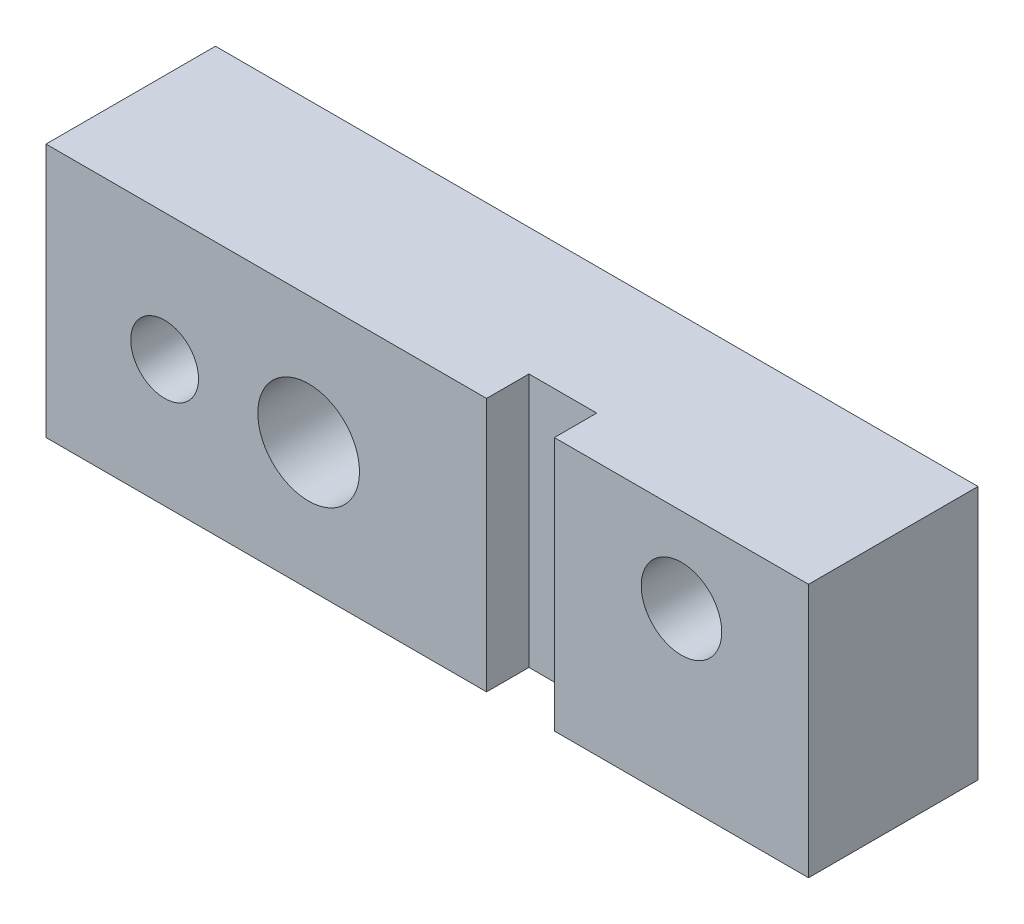
ISO-10303-21;
HEADER;
FILE_DESCRIPTION(('STEP AP214'),'2;1');
FILE_NAME('part.step','',(''),(''),'','','');
FILE_SCHEMA(('AUTOMOTIVE_DESIGN { 1 0 10303 214 1 1 1 1 }'));
ENDSEC;
DATA;
#1=APPLICATION_CONTEXT('core data for automotive mechanical design processes');
#2=APPLICATION_PROTOCOL_DEFINITION('international standard','automotive_design',2000,#1);
#3=PRODUCT_CONTEXT('',#1,'mechanical');
#4=PRODUCT('Part','Part','',(#3));
#5=PRODUCT_RELATED_PRODUCT_CATEGORY('part','',(#4));
#6=PRODUCT_DEFINITION_FORMATION('','',#4);
#7=PRODUCT_DEFINITION_CONTEXT('part definition',#1,'design');
#8=PRODUCT_DEFINITION('design','',#6,#7);
#9=PRODUCT_DEFINITION_SHAPE('','',#8);
#10=(LENGTH_UNIT() NAMED_UNIT(*) SI_UNIT(.MILLI.,.METRE.));
#11=(NAMED_UNIT(*) PLANE_ANGLE_UNIT() SI_UNIT($,.RADIAN.));
#12=(NAMED_UNIT(*) SI_UNIT($,.STERADIAN.) SOLID_ANGLE_UNIT());
#13=UNCERTAINTY_MEASURE_WITH_UNIT(LENGTH_MEASURE(1.E-05),#10,'distance_accuracy_value','');
#14=(GEOMETRIC_REPRESENTATION_CONTEXT(3) GLOBAL_UNCERTAINTY_ASSIGNED_CONTEXT((#13)) GLOBAL_UNIT_ASSIGNED_CONTEXT((#10,
#11,#12)) REPRESENTATION_CONTEXT('',''));
#15=CARTESIAN_POINT('',(0.,0.,0.));
#16=DIRECTION('',(0.,0.,1.));
#17=DIRECTION('',(1.,0.,0.));
#18=AXIS2_PLACEMENT_3D('',#15,#16,#17);
#19=CARTESIAN_POINT('',(0.,0.,0.));
#20=DIRECTION('',(0.,0.,-1.));
#21=DIRECTION('',(-1.,0.,0.));
#22=AXIS2_PLACEMENT_3D('',#19,#20,#21);
#23=PLANE('',#22);
#24=CARTESIAN_POINT('',(14.,15.,0.));
#25=DIRECTION('',(0.,0.,1.));
#26=DIRECTION('',(1.,0.,0.));
#27=AXIS2_PLACEMENT_3D('',#24,#25,#26);
#28=CIRCLE('',#27,4.);
#29=CARTESIAN_POINT('',(18.,15.,0.));
#30=VERTEX_POINT('',#29);
#31=EDGE_CURVE('E121',#30,#30,#28,.T.);
#32=ORIENTED_EDGE('',*,*,#31,.F.);
#33=EDGE_LOOP('',(#32));
#34=FACE_BOUND('',#33,.T.);
#35=CARTESIAN_POINT('',(31.,15.,0.));
#36=DIRECTION('',(0.,0.,1.));
#37=DIRECTION('',(1.,0.,0.));
#38=AXIS2_PLACEMENT_3D('',#35,#36,#37);
#39=CIRCLE('',#38,5.99999999999999);
#40=CARTESIAN_POINT('',(37.,15.,0.));
#41=VERTEX_POINT('',#40);
#42=EDGE_CURVE('E135',#41,#41,#39,.T.);
#43=ORIENTED_EDGE('',*,*,#42,.F.);
#44=EDGE_LOOP('',(#43));
#45=FACE_BOUND('',#44,.T.);
#46=DIRECTION('',(1.,0.,0.));
#47=VECTOR('',#46,1.);
#48=CARTESIAN_POINT('',(0.,0.,0.));
#49=LINE('',#48,#47);
#50=CARTESIAN_POINT('',(0.,0.,0.));
#51=VERTEX_POINT('',#50);
#52=CARTESIAN_POINT('',(52.,0.,0.));
#53=VERTEX_POINT('',#52);
#54=EDGE_CURVE('E183',#51,#53,#49,.T.);
#55=ORIENTED_EDGE('',*,*,#54,.T.);
#56=DIRECTION('',(0.,-1.,0.));
#57=VECTOR('',#56,1.);
#58=CARTESIAN_POINT('',(52.,30.,0.));
#59=LINE('',#58,#57);
#60=CARTESIAN_POINT('',(52.,30.,0.));
#61=VERTEX_POINT('',#60);
#62=EDGE_CURVE('E142',#61,#53,#59,.T.);
#63=ORIENTED_EDGE('',*,*,#62,.F.);
#64=DIRECTION('',(-1.,0.,0.));
#65=VECTOR('',#64,1.);
#66=CARTESIAN_POINT('',(0.,30.,0.));
#67=LINE('',#66,#65);
#68=CARTESIAN_POINT('',(0.,30.,0.));
#69=VERTEX_POINT('',#68);
#70=EDGE_CURVE('E82',#61,#69,#67,.T.);
#71=ORIENTED_EDGE('',*,*,#70,.T.);
#72=DIRECTION('',(0.,-1.,0.));
#73=VECTOR('',#72,1.);
#74=CARTESIAN_POINT('',(0.,0.,0.));
#75=LINE('',#74,#73);
#76=EDGE_CURVE('E163',#69,#51,#75,.T.);
#77=ORIENTED_EDGE('',*,*,#76,.T.);
#78=EDGE_LOOP('',(#55,#63,#71,#77));
#79=FACE_BOUND('',#78,.T.);
#80=ADVANCED_FACE('F35',(#34,#45,#79),#23,.F.);
#81=CARTESIAN_POINT('',(0.,0.,-20.));
#82=DIRECTION('',(-1.,0.,0.));
#83=DIRECTION('',(0.,0.,1.));
#84=AXIS2_PLACEMENT_3D('',#81,#82,#83);
#85=PLANE('',#84);
#86=ORIENTED_EDGE('',*,*,#76,.F.);
#87=DIRECTION('',(0.,0.,1.));
#88=VECTOR('',#87,1.);
#89=CARTESIAN_POINT('',(0.,30.,-20.));
#90=LINE('',#89,#88);
#91=CARTESIAN_POINT('',(0.,30.,-20.));
#92=VERTEX_POINT('',#91);
#93=EDGE_CURVE('E11',#92,#69,#90,.T.);
#94=ORIENTED_EDGE('',*,*,#93,.F.);
#95=DIRECTION('',(0.,-1.,0.));
#96=VECTOR('',#95,1.);
#97=CARTESIAN_POINT('',(0.,0.,-20.));
#98=LINE('',#97,#96);
#99=CARTESIAN_POINT('',(0.,0.,-20.));
#100=VERTEX_POINT('',#99);
#101=EDGE_CURVE('E170',#92,#100,#98,.T.);
#102=ORIENTED_EDGE('',*,*,#101,.T.);
#103=DIRECTION('',(0.,0.,1.));
#104=VECTOR('',#103,1.);
#105=CARTESIAN_POINT('',(0.,0.,-20.));
#106=LINE('',#105,#104);
#107=EDGE_CURVE('E39',#100,#51,#106,.T.);
#108=ORIENTED_EDGE('',*,*,#107,.T.);
#109=EDGE_LOOP('',(#86,#94,#102,#108));
#110=FACE_BOUND('',#109,.T.);
#111=ADVANCED_FACE('F37',(#110),#85,.T.);
#112=CARTESIAN_POINT('',(0.,30.,-20.));
#113=DIRECTION('',(0.,1.,0.));
#114=DIRECTION('',(0.,0.,1.));
#115=AXIS2_PLACEMENT_3D('',#112,#113,#114);
#116=PLANE('',#115);
#117=DIRECTION('',(0.,0.,1.));
#118=VECTOR('',#117,1.);
#119=CARTESIAN_POINT('',(52.,30.,-5.));
#120=LINE('',#119,#118);
#121=CARTESIAN_POINT('',(52.,30.,-5.));
#122=VERTEX_POINT('',#121);
#123=EDGE_CURVE('E161',#122,#61,#120,.T.);
#124=ORIENTED_EDGE('',*,*,#123,.F.);
#125=DIRECTION('',(-1.,0.,0.));
#126=VECTOR('',#125,1.);
#127=CARTESIAN_POINT('',(52.,30.,-5.));
#128=LINE('',#127,#126);
#129=CARTESIAN_POINT('',(60.,30.,-5.));
#130=VERTEX_POINT('',#129);
#131=EDGE_CURVE('E155',#130,#122,#128,.T.);
#132=ORIENTED_EDGE('',*,*,#131,.F.);
#133=DIRECTION('',(0.,0.,1.));
#134=VECTOR('',#133,1.);
#135=CARTESIAN_POINT('',(60.,30.,-5.));
#136=LINE('',#135,#134);
#137=CARTESIAN_POINT('',(60.,30.,0.));
#138=VERTEX_POINT('',#137);
#139=EDGE_CURVE('E164',#130,#138,#136,.T.);
#140=ORIENTED_EDGE('',*,*,#139,.T.);
#141=CARTESIAN_POINT('',(90.,30.,0.));
#142=VERTEX_POINT('',#141);
#143=EDGE_CURVE('E173',#142,#138,#67,.T.);
#144=ORIENTED_EDGE('',*,*,#143,.F.);
#145=DIRECTION('',(0.,0.,1.));
#146=VECTOR('',#145,1.);
#147=CARTESIAN_POINT('',(90.,30.,-20.));
#148=LINE('',#147,#146);
#149=CARTESIAN_POINT('',(90.,30.,-20.));
#150=VERTEX_POINT('',#149);
#151=EDGE_CURVE('E44',#150,#142,#148,.T.);
#152=ORIENTED_EDGE('',*,*,#151,.F.);
#153=DIRECTION('',(-1.,0.,0.));
#154=VECTOR('',#153,1.);
#155=CARTESIAN_POINT('',(0.,30.,-20.));
#156=LINE('',#155,#154);
#157=EDGE_CURVE('E178',#150,#92,#156,.T.);
#158=ORIENTED_EDGE('',*,*,#157,.T.);
#159=ORIENTED_EDGE('',*,*,#93,.T.);
#160=ORIENTED_EDGE('',*,*,#70,.F.);
#161=EDGE_LOOP('',(#124,#132,#140,#144,#152,#158,#159,#160));
#162=FACE_BOUND('',#161,.T.);
#163=ADVANCED_FACE('F204',(#162),#116,.T.);
#164=CARTESIAN_POINT('',(90.,0.,-20.));
#165=DIRECTION('',(1.,0.,0.));
#166=DIRECTION('',(0.,0.,-1.));
#167=AXIS2_PLACEMENT_3D('',#164,#165,#166);
#168=PLANE('',#167);
#169=DIRECTION('',(0.,1.,0.));
#170=VECTOR('',#169,1.);
#171=CARTESIAN_POINT('',(90.,0.,0.));
#172=LINE('',#171,#170);
#173=CARTESIAN_POINT('',(90.,0.,0.));
#174=VERTEX_POINT('',#173);
#175=EDGE_CURVE('E186',#174,#142,#172,.T.);
#176=ORIENTED_EDGE('',*,*,#175,.F.);
#177=DIRECTION('',(0.,0.,1.));
#178=VECTOR('',#177,1.);
#179=CARTESIAN_POINT('',(90.,0.,-20.));
#180=LINE('',#179,#178);
#181=CARTESIAN_POINT('',(90.,0.,-20.));
#182=VERTEX_POINT('',#181);
#183=EDGE_CURVE('E191',#182,#174,#180,.T.);
#184=ORIENTED_EDGE('',*,*,#183,.F.);
#185=DIRECTION('',(0.,1.,0.));
#186=VECTOR('',#185,1.);
#187=CARTESIAN_POINT('',(90.,0.,-20.));
#188=LINE('',#187,#186);
#189=EDGE_CURVE('E175',#182,#150,#188,.T.);
#190=ORIENTED_EDGE('',*,*,#189,.T.);
#191=ORIENTED_EDGE('',*,*,#151,.T.);
#192=EDGE_LOOP('',(#176,#184,#190,#191));
#193=FACE_BOUND('',#192,.T.);
#194=ADVANCED_FACE('F233',(#193),#168,.T.);
#195=CARTESIAN_POINT('',(0.,0.,-20.));
#196=DIRECTION('',(0.,-1.,0.));
#197=DIRECTION('',(0.,0.,-1.));
#198=AXIS2_PLACEMENT_3D('',#195,#196,#197);
#199=PLANE('',#198);
#200=DIRECTION('',(0.,0.,1.));
#201=VECTOR('',#200,1.);
#202=CARTESIAN_POINT('',(52.,0.,-5.));
#203=LINE('',#202,#201);
#204=CARTESIAN_POINT('',(52.,0.,-5.));
#205=VERTEX_POINT('',#204);
#206=EDGE_CURVE('E158',#205,#53,#203,.T.);
#207=ORIENTED_EDGE('',*,*,#206,.T.);
#208=ORIENTED_EDGE('',*,*,#54,.F.);
#209=ORIENTED_EDGE('',*,*,#107,.F.);
#210=DIRECTION('',(1.,0.,0.));
#211=VECTOR('',#210,1.);
#212=CARTESIAN_POINT('',(0.,0.,-20.));
#213=LINE('',#212,#211);
#214=EDGE_CURVE('E172',#100,#182,#213,.T.);
#215=ORIENTED_EDGE('',*,*,#214,.T.);
#216=ORIENTED_EDGE('',*,*,#183,.T.);
#217=CARTESIAN_POINT('',(60.,0.,0.));
#218=VERTEX_POINT('',#217);
#219=EDGE_CURVE('E182',#218,#174,#49,.T.);
#220=ORIENTED_EDGE('',*,*,#219,.F.);
#221=DIRECTION('',(0.,0.,1.));
#222=VECTOR('',#221,1.);
#223=CARTESIAN_POINT('',(60.,0.,-5.));
#224=LINE('',#223,#222);
#225=CARTESIAN_POINT('',(60.,0.,-5.));
#226=VERTEX_POINT('',#225);
#227=EDGE_CURVE('E52',#226,#218,#224,.T.);
#228=ORIENTED_EDGE('',*,*,#227,.F.);
#229=DIRECTION('',(1.,0.,0.));
#230=VECTOR('',#229,1.);
#231=CARTESIAN_POINT('',(52.,0.,-5.));
#232=LINE('',#231,#230);
#233=EDGE_CURVE('E148',#205,#226,#232,.T.);
#234=ORIENTED_EDGE('',*,*,#233,.F.);
#235=EDGE_LOOP('',(#207,#208,#209,#215,#216,#220,#228,#234));
#236=FACE_BOUND('',#235,.T.);
#237=ADVANCED_FACE('F195',(#236),#199,.T.);
#238=CARTESIAN_POINT('',(0.,0.,-20.));
#239=DIRECTION('',(0.,0.,-1.));
#240=DIRECTION('',(-1.,0.,0.));
#241=AXIS2_PLACEMENT_3D('',#238,#239,#240);
#242=PLANE('',#241);
#243=CARTESIAN_POINT('',(31.,15.,-20.));
#244=DIRECTION('',(0.,0.,1.));
#245=DIRECTION('',(1.,0.,0.));
#246=AXIS2_PLACEMENT_3D('',#243,#244,#245);
#247=CIRCLE('',#246,3.);
#248=CARTESIAN_POINT('',(34.,15.,-20.));
#249=VERTEX_POINT('',#248);
#250=EDGE_CURVE('E124',#249,#249,#247,.T.);
#251=ORIENTED_EDGE('',*,*,#250,.T.);
#252=EDGE_LOOP('',(#251));
#253=FACE_BOUND('',#252,.T.);
#254=CARTESIAN_POINT('',(75.,20.,-20.));
#255=DIRECTION('',(0.,0.,1.));
#256=DIRECTION('',(1.,0.,0.));
#257=AXIS2_PLACEMENT_3D('',#254,#255,#256);
#258=CIRCLE('',#257,4.75);
#259=CARTESIAN_POINT('',(79.75,20.,-20.));
#260=VERTEX_POINT('',#259);
#261=EDGE_CURVE('E139',#260,#260,#258,.T.);
#262=ORIENTED_EDGE('',*,*,#261,.T.);
#263=EDGE_LOOP('',(#262));
#264=FACE_BOUND('',#263,.T.);
#265=ORIENTED_EDGE('',*,*,#101,.F.);
#266=ORIENTED_EDGE('',*,*,#157,.F.);
#267=ORIENTED_EDGE('',*,*,#189,.F.);
#268=ORIENTED_EDGE('',*,*,#214,.F.);
#269=EDGE_LOOP('',(#265,#266,#267,#268));
#270=FACE_BOUND('',#269,.T.);
#271=ADVANCED_FACE('F211',(#253,#264,#270),#242,.T.);
#272=CARTESIAN_POINT('',(75.,20.,0.));
#273=DIRECTION('',(0.,0.,1.));
#274=DIRECTION('',(1.,0.,0.));
#275=AXIS2_PLACEMENT_3D('',#272,#273,#274);
#276=CIRCLE('',#275,4.75);
#277=CARTESIAN_POINT('',(79.75,20.,0.));
#278=VERTEX_POINT('',#277);
#279=EDGE_CURVE('E138',#278,#278,#276,.T.);
#280=ORIENTED_EDGE('',*,*,#279,.F.);
#281=EDGE_LOOP('',(#280));
#282=FACE_BOUND('',#281,.T.);
#283=ORIENTED_EDGE('',*,*,#143,.T.);
#284=DIRECTION('',(0.,1.,0.));
#285=VECTOR('',#284,1.);
#286=CARTESIAN_POINT('',(60.,30.,0.));
#287=LINE('',#286,#285);
#288=EDGE_CURVE('E149',#218,#138,#287,.T.);
#289=ORIENTED_EDGE('',*,*,#288,.F.);
#290=ORIENTED_EDGE('',*,*,#219,.T.);
#291=ORIENTED_EDGE('',*,*,#175,.T.);
#292=EDGE_LOOP('',(#283,#289,#290,#291));
#293=FACE_BOUND('',#292,.T.);
#294=ADVANCED_FACE('F200',(#282,#293),#23,.F.);
#295=CARTESIAN_POINT('',(52.,30.,-5.));
#296=DIRECTION('',(-1.,0.,0.));
#297=DIRECTION('',(0.,-1.,0.));
#298=AXIS2_PLACEMENT_3D('',#295,#296,#297);
#299=PLANE('',#298);
#300=ORIENTED_EDGE('',*,*,#62,.T.);
#301=ORIENTED_EDGE('',*,*,#206,.F.);
#302=DIRECTION('',(0.,-1.,0.));
#303=VECTOR('',#302,1.);
#304=CARTESIAN_POINT('',(52.,30.,-5.));
#305=LINE('',#304,#303);
#306=EDGE_CURVE('E145',#122,#205,#305,.T.);
#307=ORIENTED_EDGE('',*,*,#306,.F.);
#308=ORIENTED_EDGE('',*,*,#123,.T.);
#309=EDGE_LOOP('',(#300,#301,#307,#308));
#310=FACE_BOUND('',#309,.T.);
#311=ADVANCED_FACE('F210',(#310),#299,.F.);
#312=CARTESIAN_POINT('',(60.,30.,-5.));
#313=DIRECTION('',(1.,0.,0.));
#314=DIRECTION('',(0.,1.,0.));
#315=AXIS2_PLACEMENT_3D('',#312,#313,#314);
#316=PLANE('',#315);
#317=ORIENTED_EDGE('',*,*,#288,.T.);
#318=ORIENTED_EDGE('',*,*,#139,.F.);
#319=DIRECTION('',(0.,1.,0.));
#320=VECTOR('',#319,1.);
#321=CARTESIAN_POINT('',(60.,30.,-5.));
#322=LINE('',#321,#320);
#323=EDGE_CURVE('E152',#226,#130,#322,.T.);
#324=ORIENTED_EDGE('',*,*,#323,.F.);
#325=ORIENTED_EDGE('',*,*,#227,.T.);
#326=EDGE_LOOP('',(#317,#318,#324,#325));
#327=FACE_BOUND('',#326,.T.);
#328=ADVANCED_FACE('F217',(#327),#316,.F.);
#329=CARTESIAN_POINT('',(0.,0.,-5.));
#330=DIRECTION('',(0.,0.,1.));
#331=DIRECTION('',(1.,0.,0.));
#332=AXIS2_PLACEMENT_3D('',#329,#330,#331);
#333=PLANE('',#332);
#334=ORIENTED_EDGE('',*,*,#306,.T.);
#335=ORIENTED_EDGE('',*,*,#233,.T.);
#336=ORIENTED_EDGE('',*,*,#323,.T.);
#337=ORIENTED_EDGE('',*,*,#131,.T.);
#338=EDGE_LOOP('',(#334,#335,#336,#337));
#339=FACE_BOUND('',#338,.T.);
#340=ADVANCED_FACE('F228',(#339),#333,.T.);
#341=CARTESIAN_POINT('',(75.,20.,-20.));
#342=DIRECTION('',(0.,0.,1.));
#343=DIRECTION('',(1.,0.,0.));
#344=AXIS2_PLACEMENT_3D('',#341,#342,#343);
#345=CYLINDRICAL_SURFACE('',#344,4.75);
#346=ORIENTED_EDGE('',*,*,#261,.F.);
#347=EDGE_LOOP('',(#346));
#348=FACE_BOUND('',#347,.T.);
#349=ORIENTED_EDGE('',*,*,#279,.T.);
#350=EDGE_LOOP('',(#349));
#351=FACE_BOUND('',#350,.T.);
#352=ADVANCED_FACE('F296',(#348,#351),#345,.F.);
#353=CARTESIAN_POINT('',(31.,15.,0.));
#354=DIRECTION('',(0.,0.,1.));
#355=DIRECTION('',(1.,0.,0.));
#356=AXIS2_PLACEMENT_3D('',#353,#354,#355);
#357=CYLINDRICAL_SURFACE('',#356,6.);
#358=CARTESIAN_POINT('',(31.,15.,-12.));
#359=DIRECTION('',(0.,0.,1.));
#360=DIRECTION('',(1.,0.,0.));
#361=AXIS2_PLACEMENT_3D('',#358,#359,#360);
#362=CIRCLE('',#361,6.);
#363=CARTESIAN_POINT('',(37.,15.,-12.));
#364=VERTEX_POINT('',#363);
#365=EDGE_CURVE('E132',#364,#364,#362,.T.);
#366=ORIENTED_EDGE('',*,*,#365,.F.);
#367=EDGE_LOOP('',(#366));
#368=FACE_BOUND('',#367,.T.);
#369=ORIENTED_EDGE('',*,*,#42,.T.);
#370=EDGE_LOOP('',(#369));
#371=FACE_BOUND('',#370,.T.);
#372=ADVANCED_FACE('F303',(#368,#371),#357,.F.);
#373=CARTESIAN_POINT('',(37.,15.,-12.));
#374=DIRECTION('',(0.,0.,-1.));
#375=DIRECTION('',(-1.,0.,0.));
#376=AXIS2_PLACEMENT_3D('',#373,#374,#375);
#377=PLANE('',#376);
#378=CARTESIAN_POINT('',(31.,15.,-12.));
#379=DIRECTION('',(0.,0.,1.));
#380=DIRECTION('',(1.,0.,0.));
#381=AXIS2_PLACEMENT_3D('',#378,#379,#380);
#382=CIRCLE('',#381,3.);
#383=CARTESIAN_POINT('',(34.,15.,-12.));
#384=VERTEX_POINT('',#383);
#385=EDGE_CURVE('E129',#384,#384,#382,.T.);
#386=ORIENTED_EDGE('',*,*,#385,.F.);
#387=EDGE_LOOP('',(#386));
#388=FACE_BOUND('',#387,.T.);
#389=ORIENTED_EDGE('',*,*,#365,.T.);
#390=EDGE_LOOP('',(#389));
#391=FACE_BOUND('',#390,.T.);
#392=ADVANCED_FACE('F311',(#388,#391),#377,.F.);
#393=CARTESIAN_POINT('',(31.,15.,0.));
#394=DIRECTION('',(0.,0.,1.));
#395=DIRECTION('',(1.,0.,0.));
#396=AXIS2_PLACEMENT_3D('',#393,#394,#395);
#397=CYLINDRICAL_SURFACE('',#396,3.);
#398=ORIENTED_EDGE('',*,*,#250,.F.);
#399=EDGE_LOOP('',(#398));
#400=FACE_BOUND('',#399,.T.);
#401=ORIENTED_EDGE('',*,*,#385,.T.);
#402=EDGE_LOOP('',(#401));
#403=FACE_BOUND('',#402,.T.);
#404=ADVANCED_FACE('F320',(#400,#403),#397,.F.);
#405=CARTESIAN_POINT('',(14.,15.,0.));
#406=DIRECTION('',(0.,0.,1.));
#407=DIRECTION('',(1.,0.,0.));
#408=AXIS2_PLACEMENT_3D('',#405,#406,#407);
#409=CYLINDRICAL_SURFACE('',#408,4.);
#410=CARTESIAN_POINT('',(14.,15.,-10.));
#411=DIRECTION('',(0.,0.,1.));
#412=DIRECTION('',(1.,0.,0.));
#413=AXIS2_PLACEMENT_3D('',#410,#411,#412);
#414=CIRCLE('',#413,4.);
#415=CARTESIAN_POINT('',(18.,15.,-10.));
#416=VERTEX_POINT('',#415);
#417=EDGE_CURVE('E119',#416,#416,#414,.T.);
#418=ORIENTED_EDGE('',*,*,#417,.F.);
#419=EDGE_LOOP('',(#418));
#420=FACE_BOUND('',#419,.T.);
#421=ORIENTED_EDGE('',*,*,#31,.T.);
#422=EDGE_LOOP('',(#421));
#423=FACE_BOUND('',#422,.T.);
#424=ADVANCED_FACE('F115',(#420,#423),#409,.F.);
#425=CARTESIAN_POINT('',(14.,15.,-10.));
#426=DIRECTION('',(0.,0.,1.));
#427=DIRECTION('',(1.,0.,0.));
#428=AXIS2_PLACEMENT_3D('',#425,#426,#427);
#429=CONICAL_SURFACE('',#428,4.,1.04719755119659);
#430=CARTESIAN_POINT('',(14.,15.,-12.3094010767585));
#431=VERTEX_POINT('',#430);
#432=VERTEX_LOOP('',#431);
#433=FACE_BOUND('',#432,.T.);
#434=ORIENTED_EDGE('',*,*,#417,.T.);
#435=EDGE_LOOP('',(#434));
#436=FACE_BOUND('',#435,.T.);
#437=ADVANCED_FACE('F112',(#433,#436),#429,.F.);
#438=CLOSED_SHELL('',(#80,#111,#163,#194,#237,#271,#294,#311,#328,#340,#352,#372,#392,#404,#424,#437));
#439=MANIFOLD_SOLID_BREP('B2',#438);
#440=ADVANCED_BREP_SHAPE_REPRESENTATION('',(#18,#439),#14);
#441=SHAPE_DEFINITION_REPRESENTATION(#9,#440);
ENDSEC;
END-ISO-10303-21;
